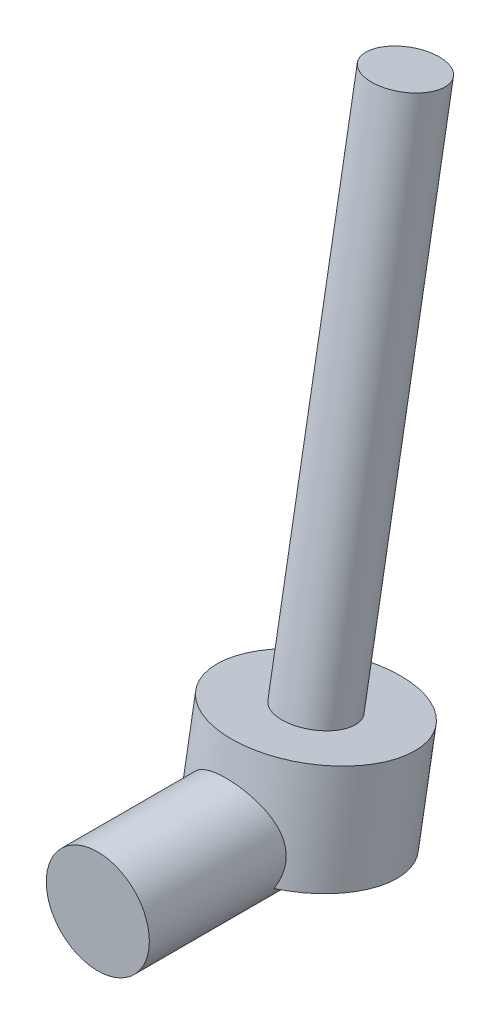
ISO-10303-21;
HEADER;
FILE_DESCRIPTION(('STEP AP214'),'2;1');
FILE_NAME('part.step','',(''),(''),'','','');
FILE_SCHEMA(('AUTOMOTIVE_DESIGN { 1 0 10303 214 1 1 1 1 }'));
ENDSEC;
DATA;
#1=APPLICATION_CONTEXT('core data for automotive mechanical design processes');
#2=APPLICATION_PROTOCOL_DEFINITION('international standard','automotive_design',2000,#1);
#3=PRODUCT_CONTEXT('',#1,'mechanical');
#4=PRODUCT('Part','Part','',(#3));
#5=PRODUCT_RELATED_PRODUCT_CATEGORY('part','',(#4));
#6=PRODUCT_DEFINITION_FORMATION('','',#4);
#7=PRODUCT_DEFINITION_CONTEXT('part definition',#1,'design');
#8=PRODUCT_DEFINITION('design','',#6,#7);
#9=PRODUCT_DEFINITION_SHAPE('','',#8);
#10=(LENGTH_UNIT() NAMED_UNIT(*) SI_UNIT(.MILLI.,.METRE.));
#11=(NAMED_UNIT(*) PLANE_ANGLE_UNIT() SI_UNIT($,.RADIAN.));
#12=(NAMED_UNIT(*) SI_UNIT($,.STERADIAN.) SOLID_ANGLE_UNIT());
#13=UNCERTAINTY_MEASURE_WITH_UNIT(LENGTH_MEASURE(1.E-05),#10,'distance_accuracy_value','');
#14=(GEOMETRIC_REPRESENTATION_CONTEXT(3) GLOBAL_UNCERTAINTY_ASSIGNED_CONTEXT((#13)) GLOBAL_UNIT_ASSIGNED_CONTEXT((#10,
#11,#12)) REPRESENTATION_CONTEXT('',''));
#15=CARTESIAN_POINT('',(0.,0.,0.));
#16=DIRECTION('',(0.,0.,1.));
#17=DIRECTION('',(1.,0.,0.));
#18=AXIS2_PLACEMENT_3D('',#15,#16,#17);
#19=CARTESIAN_POINT('',(0.,0.,180.));
#20=DIRECTION('',(0.,0.,-1.));
#21=DIRECTION('',(-1.,0.,0.));
#22=AXIS2_PLACEMENT_3D('',#19,#20,#21);
#23=CYLINDRICAL_SURFACE('',#22,45.);
#24=CARTESIAN_POINT('',(0.,0.,180.));
#25=DIRECTION('',(0.,0.,1.));
#26=DIRECTION('',(1.,0.,0.));
#27=AXIS2_PLACEMENT_3D('',#24,#25,#26);
#28=CIRCLE('',#27,45.);
#29=CARTESIAN_POINT('',(45.,0.,180.));
#30=VERTEX_POINT('',#29);
#31=EDGE_CURVE('E69',#30,#30,#28,.T.);
#32=ORIENTED_EDGE('',*,*,#31,.F.);
#33=EDGE_LOOP('',(#32));
#34=FACE_BOUND('',#33,.T.);
#35=CARTESIAN_POINT('',(0.,0.,172.763114494309));
#36=DIRECTION('',(0.,0.984807753012208,-0.17364817766693));
#37=DIRECTION('',(0.,-0.17364817766693,-0.984807753012208));
#38=AXIS2_PLACEMENT_3D('',#35,#36,#37);
#39=ELLIPSE('',#38,259.144671741463,45.);
#40=CARTESIAN_POINT('',(-33.1212607895112,-30.4627983565724,0.));
#41=VERTEX_POINT('',#40);
#42=CARTESIAN_POINT('',(-40.9604468792548,-18.6344249026297,67.0820393249937));
#43=VERTEX_POINT('',#42);
#44=EDGE_CURVE('E70',#41,#43,#39,.T.);
#45=ORIENTED_EDGE('',*,*,#44,.F.);
#46=CARTESIAN_POINT('',(0.,0.,0.));
#47=DIRECTION('',(0.,0.,1.));
#48=DIRECTION('',(1.,0.,0.));
#49=AXIS2_PLACEMENT_3D('',#46,#47,#48);
#50=CIRCLE('',#49,45.);
#51=CARTESIAN_POINT('',(33.1212607895112,-30.4627983565724,0.));
#52=VERTEX_POINT('',#51);
#53=EDGE_CURVE('E66',#41,#52,#50,.T.);
#54=ORIENTED_EDGE('',*,*,#53,.T.);
#55=CARTESIAN_POINT('',(40.9604468792548,-18.6344249026297,67.0820393249937));
#56=VERTEX_POINT('',#55);
#57=EDGE_CURVE('E59',#56,#52,#39,.T.);
#58=ORIENTED_EDGE('',*,*,#57,.F.);
#59=CARTESIAN_POINT('',(-45.,0.,60.9255967131447));
#60=CARTESIAN_POINT('',(-44.9999991159293,-0.609139937065266,61.0330059827623));
#61=CARTESIAN_POINT('',(-44.98762535399,-1.21671691855412,61.1495671685051));
#62=CARTESIAN_POINT('',(-44.9385725392512,-2.4273100448995,61.4003360061897));
#63=CARTESIAN_POINT('',(-44.901888783463,-3.03032528441043,61.5345470686323));
#64=CARTESIAN_POINT('',(-44.8047154202616,-4.23088414292751,61.8198668880226));
#65=CARTESIAN_POINT('',(-44.7442085188881,-4.82842346361861,61.9709878632266));
#66=CARTESIAN_POINT('',(-44.6000029722147,-6.01647732335888,62.2890515221651));
#67=CARTESIAN_POINT('',(-44.516301263168,-6.60699092364345,62.4559962941092));
#68=CARTESIAN_POINT('',(-44.2307207432687,-8.37042639744708,62.9801145408028));
#69=CARTESIAN_POINT('',(-43.9946838556498,-9.53140158592975,63.3596490439736));
#70=CARTESIAN_POINT('',(-43.4373475714821,-11.8143211749664,64.1681451457989));
#71=CARTESIAN_POINT('',(-43.1160644075782,-12.9362729604215,64.5970973255215));
#72=CARTESIAN_POINT('',(-42.3971995530052,-15.1258339246356,65.4896475970422));
#73=CARTESIAN_POINT('',(-42.0004724242164,-16.1938966213923,65.9528251375604));
#74=CARTESIAN_POINT('',(-41.1328451960755,-18.2858293267039,66.9082977123848));
#75=CARTESIAN_POINT('',(-40.6619433192142,-19.3096982754593,67.4005934442969));
#76=CARTESIAN_POINT('',(-39.649607151634,-21.3111690355483,68.4051516740259));
#77=CARTESIAN_POINT('',(-39.1081953676469,-22.2887854754881,68.9174077640948));
#78=CARTESIAN_POINT('',(-37.9573902932906,-24.1966477994101,69.9536087190405));
#79=CARTESIAN_POINT('',(-37.3479926261978,-25.1268906280024,70.4775543347143));
#80=CARTESIAN_POINT('',(-35.9461747215023,-27.1034254436611,71.624920869022));
#81=CARTESIAN_POINT('',(-35.1406317293794,-28.1400154679117,72.249087204375));
#82=CARTESIAN_POINT('',(-33.4396151785176,-30.1416260169736,73.4899766846438));
#83=CARTESIAN_POINT('',(-32.5441270826598,-31.1066349287354,74.1066986082767));
#84=CARTESIAN_POINT('',(-30.6650748891138,-32.960492261848,75.3201733831024));
#85=CARTESIAN_POINT('',(-29.6815295696127,-33.8493568422238,75.9169304546864));
#86=CARTESIAN_POINT('',(-28.1419846625522,-35.1208136983976,76.7874456859971));
#87=CARTESIAN_POINT('',(-27.6181318095782,-35.5343030865397,77.0734976518301));
#88=CARTESIAN_POINT('',(-26.5490441565275,-36.3400111564036,77.6359524216751));
#89=CARTESIAN_POINT('',(-26.0038039837078,-36.7322244335857,77.9123527676967));
#90=CARTESIAN_POINT('',(-24.539695614581,-37.7361403876692,78.6256270860911));
#91=CARTESIAN_POINT('',(-23.6032712302567,-38.3292057359366,79.0530440459829));
#92=CARTESIAN_POINT('',(-21.6769580962147,-39.4506170476452,79.8701310085459));
#93=CARTESIAN_POINT('',(-20.6870803325816,-39.9789762375157,80.2598087219871));
#94=CARTESIAN_POINT('',(-18.6574730760335,-40.9654869299457,80.9939346087182));
#95=CARTESIAN_POINT('',(-17.6177716077582,-41.4236773061081,81.338407810111));
#96=CARTESIAN_POINT('',(-15.4924239819395,-42.2645234631703,81.9750798497941));
#97=CARTESIAN_POINT('',(-14.4067774206156,-42.6471785800739,82.2672782285581));
#98=CARTESIAN_POINT('',(-12.744211442377,-43.1616282577637,82.6622417987883));
#99=CARTESIAN_POINT('',(-12.1817128327675,-43.3237866616935,82.7871398913533));
#100=CARTESIAN_POINT('',(-11.0477516731157,-43.6267278785683,83.0210484355004));
#101=CARTESIAN_POINT('',(-10.4762902436913,-43.7675133406253,83.1300608559965));
#102=CARTESIAN_POINT('',(-9.32540541038436,-44.0270926967001,83.3314687919408));
#103=CARTESIAN_POINT('',(-8.74598079016713,-44.1458831900831,83.4238617377947));
#104=CARTESIAN_POINT('',(-7.58054672476296,-44.360865136338,83.5913444948174));
#105=CARTESIAN_POINT('',(-6.99453816147481,-44.4570595789417,83.6664365950728));
#106=CARTESIAN_POINT('',(-5.81754484195042,-44.6263312930316,83.7987376550023));
#107=CARTESIAN_POINT('',(-5.22656328341982,-44.6994224043489,83.8559573207444));
#108=CARTESIAN_POINT('',(-4.04076984702626,-44.8221757530346,83.9521351303502));
#109=CARTESIAN_POINT('',(-3.44595847686832,-44.8718410336046,83.9910956462183));
#110=CARTESIAN_POINT('',(-2.25392638017337,-44.9474849081206,84.0504607051802));
#111=CARTESIAN_POINT('',(-1.65670578392432,-44.9734647661445,84.0708662385431));
#112=CARTESIAN_POINT('',(-0.461420438056616,-45.0016070109596,84.092971967514));
#113=CARTESIAN_POINT('',(0.136644279945474,-45.0037702673039,84.094672846036));
#114=CARTESIAN_POINT('',(1.76310787132273,-44.9772046240103,84.073801127755));
#115=CARTESIAN_POINT('',(2.79104287027513,-44.9250908277377,84.0328533033896));
#116=CARTESIAN_POINT('',(4.83705908776557,-44.7510601847485,83.8963839870391));
#117=CARTESIAN_POINT('',(5.85514138218005,-44.629151048896,83.8008685235915));
#118=CARTESIAN_POINT('',(7.87456403642693,-44.3174351098804,83.5574215643314));
#119=CARTESIAN_POINT('',(8.87590301965549,-44.127622752294,83.4094857805925));
#120=CARTESIAN_POINT('',(10.8553094346672,-43.682850740913,83.0643559998589));
#121=CARTESIAN_POINT('',(11.8333759064042,-43.4278884046033,82.8671599746079));
#122=CARTESIAN_POINT('',(13.7561653663288,-42.8575414146849,82.4284947134107));
#123=CARTESIAN_POINT('',(14.7010247803591,-42.5424498121669,82.18724043923));
#124=CARTESIAN_POINT('',(16.5579026822676,-41.8547033026385,81.6642238455415));
#125=CARTESIAN_POINT('',(17.4699217309984,-41.4820493792615,81.382462218235));
#126=CARTESIAN_POINT('',(19.2578396838989,-40.6828551820997,80.7830621377571));
#127=CARTESIAN_POINT('',(20.1337351335344,-40.2563097703972,80.4654202641337));
#128=CARTESIAN_POINT('',(21.8469867651123,-39.3528542051214,79.7989634662384));
#129=CARTESIAN_POINT('',(22.6843377790959,-38.8759373259237,79.4501443801272));
#130=CARTESIAN_POINT('',(23.9741958121547,-38.0860271631185,78.8786851489623));
#131=CARTESIAN_POINT('',(24.4402383375445,-37.7886038701596,78.6647857946842));
#132=CARTESIAN_POINT('',(25.3584096258389,-37.1786867373861,78.2291020553028));
#133=CARTESIAN_POINT('',(25.8105411429328,-36.8661959126,78.0073192500011));
#134=CARTESIAN_POINT('',(27.1459925579553,-35.9067796444395,77.3313557483887));
#135=CARTESIAN_POINT('',(28.0083574506224,-35.2379176968387,76.8665652643844));
#136=CARTESIAN_POINT('',(29.676257083068,-33.8452586033368,75.9154481890273));
#137=CARTESIAN_POINT('',(30.4817375327639,-33.1214103104075,75.4291017263349));
#138=CARTESIAN_POINT('',(32.0341044743209,-31.6224658335539,74.4420734378949));
#139=CARTESIAN_POINT('',(32.7809878193373,-30.8473669014263,73.9413908442213));
#140=CARTESIAN_POINT('',(34.3644409237595,-29.0821034179298,72.8274699407885));
#141=CARTESIAN_POINT('',(35.1873430759752,-28.0807435781462,72.2124855676958));
#142=CARTESIAN_POINT('',(36.7442687693956,-26.0103205398842,70.9834663031188));
#143=CARTESIAN_POINT('',(37.4782756966372,-24.9412447424024,70.3694316102289));
#144=CARTESIAN_POINT('',(38.8544002514396,-22.7381279737524,69.1549134370134));
#145=CARTESIAN_POINT('',(39.4965176486195,-21.6040868397164,68.5544299906662));
#146=CARTESIAN_POINT('',(40.6846576958541,-19.2735246437474,67.3804140134352));
#147=CARTESIAN_POINT('',(41.2307008763106,-18.0770170015177,66.8068757438001));
#148=CARTESIAN_POINT('',(42.1357660182676,-15.8358753022483,65.7963881744051));
#149=CARTESIAN_POINT('',(42.5108010437008,-14.800626693986,65.3529389443466));
#150=CARTESIAN_POINT('',(43.187367206904,-12.69162600644,64.5028338011098));
#151=CARTESIAN_POINT('',(43.4889049589706,-11.6178774018997,64.0961745791328));
#152=CARTESIAN_POINT('',(44.013687975298,-9.43672380777053,63.3288581827527));
#153=CARTESIAN_POINT('',(44.2370261740713,-8.32936048012971,62.9681467294763));
#154=CARTESIAN_POINT('',(44.6011711348656,-6.0850315956245,62.3006277355491));
#155=CARTESIAN_POINT('',(44.7419786215405,-4.94806629876918,61.9938197216204));
#156=CARTESIAN_POINT('',(44.9374541741437,-2.64136299836891,61.4390512443724));
#157=CARTESIAN_POINT('',(44.9913259833379,-1.47142081625991,61.1916522291629));
#158=CARTESIAN_POINT('',(45.0067408762185,0.881538157638272,60.7650256222602));
#159=CARTESIAN_POINT('',(44.968285128649,2.06455478373368,60.5857971676516));
#160=CARTESIAN_POINT('',(44.796933691981,4.43202048741217,60.2983131782219));
#161=CARTESIAN_POINT('',(44.6640680731688,5.6164689890463,60.1900350662607));
#162=CARTESIAN_POINT('',(44.3037178788481,7.97518517239839,60.0436875438258));
#163=CARTESIAN_POINT('',(44.0762410688096,9.14945368159369,60.0056123726486));
#164=CARTESIAN_POINT('',(43.5650782957811,11.3206326692935,59.9962125334087));
#165=CARTESIAN_POINT('',(43.2929680360163,12.3202717856911,60.016646730114));
#166=CARTESIAN_POINT('',(42.6811416225773,14.2964986504187,60.1027278643172));
#167=CARTESIAN_POINT('',(42.3414327214069,15.2730888590511,60.1683699534212));
#168=CARTESIAN_POINT('',(41.5968753704846,17.1978278965173,60.3394673015865));
#169=CARTESIAN_POINT('',(41.1920038510295,18.1459665109847,60.4449366786824));
#170=CARTESIAN_POINT('',(40.3200907780493,20.0086980689497,60.6896114239404));
#171=CARTESIAN_POINT('',(39.8530445135083,20.9232884637746,60.8288193491482));
#172=CARTESIAN_POINT('',(38.8252334246809,22.7772109666324,61.1452833354667));
#173=CARTESIAN_POINT('',(38.2602109727141,23.7138444328125,61.3245114225424));
#174=CARTESIAN_POINT('',(37.0660394549423,25.5401502936986,61.706644614197));
#175=CARTESIAN_POINT('',(36.4368888239703,26.4298215414001,61.9095502966888));
#176=CARTESIAN_POINT('',(35.117584510596,28.1591640325607,62.3317424513225));
#177=CARTESIAN_POINT('',(34.4274059569147,28.998814655157,62.5510355963086));
#178=CARTESIAN_POINT('',(32.9895040043484,30.6246727579328,62.998961315159));
#179=CARTESIAN_POINT('',(32.2417766388499,31.4108765471859,63.2275945322872));
#180=CARTESIAN_POINT('',(30.5739957899552,33.0422527514201,63.7226829421992));
#181=CARTESIAN_POINT('',(29.6450309577935,33.8782019393512,63.9896008595583));
#182=CARTESIAN_POINT('',(27.7198166055693,35.4707293001545,64.5179279074251));
#183=CARTESIAN_POINT('',(26.7235610659265,36.227300356651,64.779336542341));
#184=CARTESIAN_POINT('',(24.6687943568104,37.6565666517242,65.2882293406065));
#185=CARTESIAN_POINT('',(23.6102678767191,38.3292411346488,65.5357100499699));
#186=CARTESIAN_POINT('',(21.4370607113752,39.585700866745,66.0089486615224));
#187=CARTESIAN_POINT('',(20.3223810559901,40.169487745355,66.2347069618867));
#188=CARTESIAN_POINT('',(18.0179800255575,41.2554316346895,66.6623087855483));
#189=CARTESIAN_POINT('',(16.8271379251079,41.7554711046019,66.8635045691536));
#190=CARTESIAN_POINT('',(14.4018176646443,42.6527769092506,67.229494404029));
#191=CARTESIAN_POINT('',(13.1673383067547,43.0500404202151,67.3942874551152));
#192=CARTESIAN_POINT('',(10.6647492676759,43.7372374631844,67.6820439653041));
#193=CARTESIAN_POINT('',(9.39665769462477,44.027227576623,67.8050294730444));
#194=CARTESIAN_POINT('',(6.83664672193705,44.4966665298974,68.0052329809397));
#195=CARTESIAN_POINT('',(5.54472935667782,44.6761247629578,68.0824548701592));
#196=CARTESIAN_POINT('',(3.04741769862456,44.9128526110081,68.1845312958199));
#197=CARTESIAN_POINT('',(1.84294611142171,44.9784032716859,68.212933099852));
#198=CARTESIAN_POINT('',(-0.567596203897696,45.0125600670574,68.2277183635772));
#199=CARTESIAN_POINT('',(-1.7736668428519,44.9811713971163,68.2141040750803));
#200=CARTESIAN_POINT('',(-4.1780398062215,44.8218195774803,68.1452526702167));
#201=CARTESIAN_POINT('',(-5.37634307232356,44.6938683641994,68.0900206983502));
#202=CARTESIAN_POINT('',(-7.75636101481881,44.3428211708456,67.939515762425));
#203=CARTESIAN_POINT('',(-8.93807570620227,44.1197252767559,67.8442428345518));
#204=CARTESIAN_POINT('',(-11.2384171405908,43.5895139309959,67.6200559790295));
#205=CARTESIAN_POINT('',(-12.3578463208791,43.2853628537181,67.4923352451668));
#206=CARTESIAN_POINT('',(-14.5661685724124,42.5930245439561,67.2052743715208));
#207=CARTESIAN_POINT('',(-15.6550625815487,42.2048398957728,67.0459352041179));
#208=CARTESIAN_POINT('',(-17.7961187476672,41.3476494021356,66.6997207783887));
#209=CARTESIAN_POINT('',(-18.8482770408443,40.8786350857551,66.5128426342831));
#210=CARTESIAN_POINT('',(-20.9101629865852,39.8633394169866,66.1163378979609));
#211=CARTESIAN_POINT('',(-21.9198886503363,39.3170544481591,65.9067102411233));
#212=CARTESIAN_POINT('',(-23.9473478052922,38.1180846018192,65.4578064171888));
#213=CARTESIAN_POINT('',(-24.9623445665353,37.4611464769252,65.217526238117));
#214=CARTESIAN_POINT('',(-26.9342640208652,36.0694051131455,64.724567325376));
#215=CARTESIAN_POINT('',(-27.8911848053203,35.3345993173631,64.4718881847154));
#216=CARTESIAN_POINT('',(-29.7429177026383,33.7907233141841,63.9615949772179));
#217=CARTESIAN_POINT('',(-30.6376848769231,32.9816003353166,63.703977508082));
#218=CARTESIAN_POINT('',(-32.3599409356047,31.2935826049042,63.1923082174183));
#219=CARTESIAN_POINT('',(-33.1874271918379,30.414685130438,62.9382565354996));
#220=CARTESIAN_POINT('',(-34.8251914069903,28.5284277965491,62.4256940269565));
#221=CARTESIAN_POINT('',(-35.6303775066538,27.5163904504611,62.1680768723931));
#222=CARTESIAN_POINT('',(-37.1533854613913,25.4224785238407,61.6790940259578));
#223=CARTESIAN_POINT('',(-37.8712001715483,24.3405982428615,61.4477304811161));
#224=CARTESIAN_POINT('',(-39.2135950285012,22.1129737331876,61.0239487291825));
#225=CARTESIAN_POINT('',(-39.838188101256,20.9672383888451,60.8315251214238));
#226=CARTESIAN_POINT('',(-40.7003674731074,19.2069665985761,60.5819196157707));
#227=CARTESIAN_POINT('',(-40.9753319866287,18.613204795945,60.5052172066247));
#228=CARTESIAN_POINT('',(-41.4996576794181,17.4128424429416,60.3664020449806));
#229=CARTESIAN_POINT('',(-41.7490226593504,16.8062438145797,60.3042871249658));
#230=CARTESIAN_POINT('',(-42.2062266955359,15.6208725918262,60.1996577026059));
#231=CARTESIAN_POINT('',(-42.4157050661224,15.0428197920292,60.1561394680548));
#232=CARTESIAN_POINT('',(-42.8110281695381,13.8778292670163,60.0843956811767));
#233=CARTESIAN_POINT('',(-42.9968763168646,13.2908928392052,60.0561679174959));
#234=CARTESIAN_POINT('',(-43.3445127642106,12.109196365006,60.016051679368));
#235=CARTESIAN_POINT('',(-43.5062941941796,11.5144341372117,60.004167862489));
#236=CARTESIAN_POINT('',(-43.8052867934997,10.3187476153817,59.9976657994014));
#237=CARTESIAN_POINT('',(-43.9425012337114,9.71782415293612,60.0030452529453));
#238=CARTESIAN_POINT('',(-44.1916703706943,8.51313301546993,60.031746127508));
#239=CARTESIAN_POINT('',(-44.3037022903519,7.90937999604847,60.0550117026955));
#240=CARTESIAN_POINT('',(-44.5028287414378,6.69883844803448,60.1199218619887));
#241=CARTESIAN_POINT('',(-44.5899267290816,6.09205035202464,60.161563896807));
#242=CARTESIAN_POINT('',(-44.7390791210407,4.87739420884024,60.2634654474646));
#243=CARTESIAN_POINT('',(-44.8011506673944,4.26952718830427,60.3237121697715));
#244=CARTESIAN_POINT('',(-44.9003886288938,3.05398616985934,60.4628591722346));
#245=CARTESIAN_POINT('',(-44.9375597156701,2.44631215713473,60.5417559496526));
#246=CARTESIAN_POINT('',(-44.9749541539634,1.53233984696652,60.6744714072032));
#247=CARTESIAN_POINT('',(-44.9843585451223,1.22538126469034,60.7214382801117));
#248=CARTESIAN_POINT('',(-44.9968810384344,0.612150506772316,60.8200337601023));
#249=CARTESIAN_POINT('',(-45.0000004439341,0.305878201975733,60.8716613983393));
#250=CARTESIAN_POINT('',(-45.,0.,60.9255967131447));
#251=B_SPLINE_CURVE_WITH_KNOTS('',3,(#59,#60,#61,#62,#63,#64,#65,#66,#67,#68,#69,#70,#71,#72,
#73,#74,#75,#76,#77,#78,#79,#80,#81,#82,#83,#84,#85,#86,#87,#88,#89,#90,#91,#92,#93,#94,#95,#96,
#97,#98,#99,#100,#101,#102,#103,#104,#105,#106,#107,#108,#109,#110,#111,#112,#113,#114,#115,
#116,#117,#118,#119,#120,#121,#122,#123,#124,#125,#126,#127,#128,#129,#130,#131,#132,#133,#134,
#135,#136,#137,#138,#139,#140,#141,#142,#143,#144,#145,#146,#147,#148,#149,#150,#151,#152,#153,
#154,#155,#156,#157,#158,#159,#160,#161,#162,#163,#164,#165,#166,#167,#168,#169,#170,#171,#172,
#173,#174,#175,#176,#177,#178,#179,#180,#181,#182,#183,#184,#185,#186,#187,#188,#189,#190,#191,
#192,#193,#194,#195,#196,#197,#198,#199,#200,#201,#202,#203,#204,#205,#206,#207,#208,#209,#210,
#211,#212,#213,#214,#215,#216,#217,#218,#219,#220,#221,#222,#223,#224,#225,#226,#227,#228,#229,
#230,#231,#232,#233,#234,#235,#236,#237,#238,#239,#240,#241,#242,#243,#244,#245,#246,#247,#248,
#249,#250),.UNSPECIFIED.,.T.,.F.,(4,2,2,2,2,2,2,2,2,2,2,2,2,2,2,2,2,2,2,2,2,2,2,2,2,2,2,2,2,2,2,
2,2,2,2,2,2,2,2,2,2,2,2,2,2,2,2,2,2,2,2,2,2,2,2,2,2,2,2,2,2,2,2,2,2,2,2,2,2,2,2,2,2,2,2,2,2,2,2,
2,2,2,2,2,2,2,2,2,2,2,2,2,2,2,2,4),(0.,1.85551114154917,3.71138135338814,5.56860129032337,
7.4260666600397,11.1528423065465,14.8789088069623,18.5650444016712,22.2512683436475,
25.9363185153203,29.6216060563238,33.9777739740142,38.3346470811878,42.6905932889422,
44.8683057632039,47.0465688523975,50.6069564020335,54.1666149624235,57.7242942778138,
61.2820048657571,63.0772030610879,64.8721785650006,66.6674313581696,68.4624464836398,
70.2563842755216,72.0500889563983,73.8436979026279,75.6372413632904,78.7232495319617,
81.8089168297455,84.8948365901065,87.9808834320151,91.0522571883643,94.1235784664359,
97.1951927800372,100.267217736892,102.045240520529,103.822908984638,107.37829051183,
110.937020651711,114.495941775707,118.795266942909,123.095394391237,127.395532620441,
131.694750820563,135.252682520894,138.810293911221,142.363662871777,145.91700063182,
149.502702917685,153.088359813566,156.672875161164,160.257096357995,163.362283764028,
166.467138201043,169.573094286096,172.679285845308,176.001372603049,179.323540461886,
182.647068530514,185.970825882375,189.800200395219,193.629917924745,197.460581038464,
201.291173922133,205.2074338408,209.123801347367,213.038100207605,216.952066376835,
220.567281143744,224.182302160239,227.796876385261,231.411447343764,234.908614687076,
238.405674496583,241.903101020085,245.400691285168,249.094766924751,252.788963902217,
256.485804655932,260.182789748329,264.133875478559,268.085284097557,272.036144310711,
274.011958578946,275.987479080105,277.835932972483,279.684119464478,281.532832528912,
283.38129927149,285.224017870518,287.066480917409,288.9076798034,290.748533161155,
291.680467042588,292.612207644686),.UNSPECIFIED.);
#252=EDGE_CURVE('E11',#56,#43,#251,.T.);
#253=ORIENTED_EDGE('',*,*,#252,.T.);
#254=EDGE_LOOP('',(#45,#54,#58,#253));
#255=FACE_BOUND('',#254,.T.);
#256=ADVANCED_FACE('F37',(#34,#255),#23,.T.);
#257=CARTESIAN_POINT('',(0.,0.,0.));
#258=DIRECTION('',(0.,0.,1.));
#259=DIRECTION('',(1.,0.,0.));
#260=AXIS2_PLACEMENT_3D('',#257,#258,#259);
#261=PLANE('',#260);
#262=DIRECTION('',(-1.,0.,0.));
#263=VECTOR('',#262,1.);
#264=CARTESIAN_POINT('',(0.,-30.4627983565724,0.));
#265=LINE('',#264,#263);
#266=EDGE_CURVE('E49',#52,#41,#265,.T.);
#267=ORIENTED_EDGE('',*,*,#266,.F.);
#268=ORIENTED_EDGE('',*,*,#53,.F.);
#269=EDGE_LOOP('',(#267,#268));
#270=FACE_BOUND('',#269,.T.);
#271=ADVANCED_FACE('F67',(#270),#261,.F.);
#272=CARTESIAN_POINT('',(0.,0.,180.));
#273=DIRECTION('',(0.,0.,1.));
#274=DIRECTION('',(1.,0.,0.));
#275=AXIS2_PLACEMENT_3D('',#272,#273,#274);
#276=PLANE('',#275);
#277=ORIENTED_EDGE('',*,*,#31,.T.);
#278=EDGE_LOOP('',(#277));
#279=FACE_BOUND('',#278,.T.);
#280=ADVANCED_FACE('F109',(#279),#276,.T.);
#281=CARTESIAN_POINT('',(0.,-29.5442325903662,5.20944533000791));
#282=DIRECTION('',(0.,0.984807753012208,-0.17364817766693));
#283=DIRECTION('',(0.,0.17364817766693,0.984807753012208));
#284=AXIS2_PLACEMENT_3D('',#281,#282,#283);
#285=CYLINDRICAL_SURFACE('',#284,75.);
#286=CARTESIAN_POINT('',(0.,59.0884651807325,-10.4188906600158));
#287=DIRECTION('',(0.,0.984807753012208,-0.17364817766693));
#288=DIRECTION('',(0.,0.17364817766693,0.984807753012208));
#289=AXIS2_PLACEMENT_3D('',#286,#287,#288);
#290=CIRCLE('',#289,75.);
#291=CARTESIAN_POINT('',(0.,72.1120785057523,63.4416908158998));
#292=VERTEX_POINT('',#291);
#293=EDGE_CURVE('E82',#292,#292,#290,.T.);
#294=ORIENTED_EDGE('',*,*,#293,.F.);
#295=EDGE_LOOP('',(#294));
#296=FACE_BOUND('',#295,.T.);
#297=ORIENTED_EDGE('',*,*,#252,.F.);
#298=CARTESIAN_POINT('',(0.,-29.5442325903662,5.20944533000791));
#299=DIRECTION('',(0.,0.984807753012208,-0.17364817766693));
#300=DIRECTION('',(0.,0.17364817766693,0.984807753012208));
#301=AXIS2_PLACEMENT_3D('',#298,#299,#300);
#302=CIRCLE('',#301,75.);
#303=EDGE_CURVE('E80',#56,#43,#302,.T.);
#304=ORIENTED_EDGE('',*,*,#303,.T.);
#305=EDGE_LOOP('',(#297,#304));
#306=FACE_BOUND('',#305,.T.);
#307=ADVANCED_FACE('F106',(#296,#306),#285,.T.);
#308=CARTESIAN_POINT('',(0.,-29.5442325903662,5.20944533000791));
#309=DIRECTION('',(0.,0.984807753012208,-0.17364817766693));
#310=DIRECTION('',(0.,0.17364817766693,0.984807753012208));
#311=AXIS2_PLACEMENT_3D('',#308,#309,#310);
#312=PLANE('',#311);
#313=ORIENTED_EDGE('',*,*,#266,.T.);
#314=ORIENTED_EDGE('',*,*,#44,.T.);
#315=ORIENTED_EDGE('',*,*,#303,.F.);
#316=ORIENTED_EDGE('',*,*,#57,.T.);
#317=EDGE_LOOP('',(#313,#314,#315,#316));
#318=FACE_BOUND('',#317,.T.);
#319=ADVANCED_FACE('F76',(#318),#312,.F.);
#320=CARTESIAN_POINT('',(0.,59.0884651807325,-10.4188906600158));
#321=DIRECTION('',(0.,0.984807753012208,-0.17364817766693));
#322=DIRECTION('',(0.,0.17364817766693,0.984807753012208));
#323=AXIS2_PLACEMENT_3D('',#320,#321,#322);
#324=PLANE('',#323);
#325=CARTESIAN_POINT('',(0.,59.0884651807325,-10.4188906600158));
#326=DIRECTION('',(0.,0.984807753012208,-0.17364817766693));
#327=DIRECTION('',(0.,0.17364817766693,0.984807753012208));
#328=AXIS2_PLACEMENT_3D('',#325,#326,#327);
#329=CIRCLE('',#328,30.);
#330=CARTESIAN_POINT('',(0.,64.2979105107404,19.1253419303504));
#331=VERTEX_POINT('',#330);
#332=EDGE_CURVE('E86',#331,#331,#329,.T.);
#333=ORIENTED_EDGE('',*,*,#332,.F.);
#334=EDGE_LOOP('',(#333));
#335=FACE_BOUND('',#334,.T.);
#336=ORIENTED_EDGE('',*,*,#293,.T.);
#337=EDGE_LOOP('',(#336));
#338=FACE_BOUND('',#337,.T.);
#339=ADVANCED_FACE('F97',(#335,#338),#324,.T.);
#340=CARTESIAN_POINT('',(0.,502.251954036226,-88.5605706101345));
#341=DIRECTION('',(0.,-0.984807753012208,0.17364817766693));
#342=DIRECTION('',(0.,-0.17364817766693,-0.984807753012208));
#343=AXIS2_PLACEMENT_3D('',#340,#341,#342);
#344=CYLINDRICAL_SURFACE('',#343,30.);
#345=CARTESIAN_POINT('',(0.,502.251954036226,-88.5605706101345));
#346=DIRECTION('',(0.,0.984807753012208,-0.17364817766693));
#347=DIRECTION('',(0.,0.17364817766693,0.984807753012208));
#348=AXIS2_PLACEMENT_3D('',#345,#346,#347);
#349=CIRCLE('',#348,30.);
#350=CARTESIAN_POINT('',(0.,507.461399366234,-59.0163380197682));
#351=VERTEX_POINT('',#350);
#352=EDGE_CURVE('E85',#351,#351,#349,.T.);
#353=ORIENTED_EDGE('',*,*,#352,.F.);
#354=EDGE_LOOP('',(#353));
#355=FACE_BOUND('',#354,.T.);
#356=ORIENTED_EDGE('',*,*,#332,.T.);
#357=EDGE_LOOP('',(#356));
#358=FACE_BOUND('',#357,.T.);
#359=ADVANCED_FACE('F94',(#355,#358),#344,.T.);
#360=CARTESIAN_POINT('',(0.,502.251954036226,-88.5605706101345));
#361=DIRECTION('',(0.,0.984807753012208,-0.17364817766693));
#362=DIRECTION('',(0.,0.17364817766693,0.984807753012208));
#363=AXIS2_PLACEMENT_3D('',#360,#361,#362);
#364=PLANE('',#363);
#365=ORIENTED_EDGE('',*,*,#352,.T.);
#366=EDGE_LOOP('',(#365));
#367=FACE_BOUND('',#366,.T.);
#368=ADVANCED_FACE('F92',(#367),#364,.T.);
#369=CLOSED_SHELL('',(#256,#271,#280,#307,#319,#339,#359,#368));
#370=MANIFOLD_SOLID_BREP('B2',#369);
#371=ADVANCED_BREP_SHAPE_REPRESENTATION('',(#18,#370),#14);
#372=SHAPE_DEFINITION_REPRESENTATION(#9,#371);
ENDSEC;
END-ISO-10303-21;
